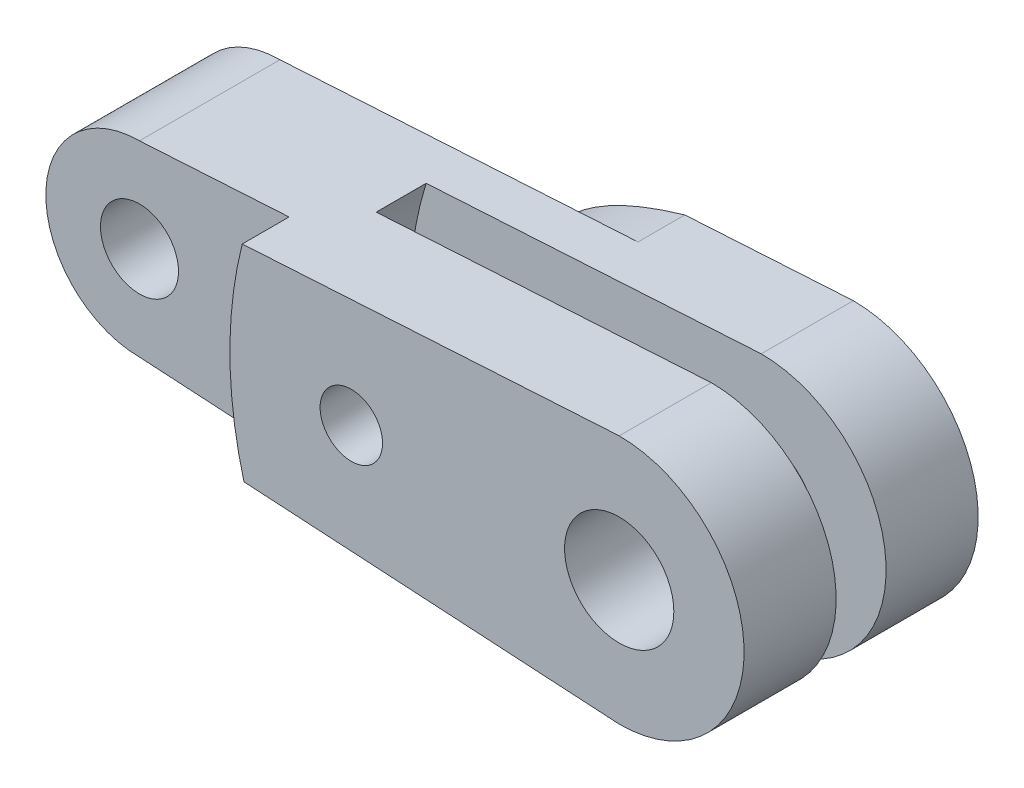
ISO-10303-21;
HEADER;
FILE_DESCRIPTION(('STEP AP214'),'2;1');
FILE_NAME('part.step','',(''),(''),'','','');
FILE_SCHEMA(('AUTOMOTIVE_DESIGN { 1 0 10303 214 1 1 1 1 }'));
ENDSEC;
DATA;
#1=APPLICATION_CONTEXT('core data for automotive mechanical design processes');
#2=APPLICATION_PROTOCOL_DEFINITION('international standard','automotive_design',2000,#1);
#3=PRODUCT_CONTEXT('',#1,'mechanical');
#4=PRODUCT('Part','Part','',(#3));
#5=PRODUCT_RELATED_PRODUCT_CATEGORY('part','',(#4));
#6=PRODUCT_DEFINITION_FORMATION('','',#4);
#7=PRODUCT_DEFINITION_CONTEXT('part definition',#1,'design');
#8=PRODUCT_DEFINITION('design','',#6,#7);
#9=PRODUCT_DEFINITION_SHAPE('','',#8);
#10=(LENGTH_UNIT() NAMED_UNIT(*) SI_UNIT(.MILLI.,.METRE.));
#11=(NAMED_UNIT(*) PLANE_ANGLE_UNIT() SI_UNIT($,.RADIAN.));
#12=(NAMED_UNIT(*) SI_UNIT($,.STERADIAN.) SOLID_ANGLE_UNIT());
#13=UNCERTAINTY_MEASURE_WITH_UNIT(LENGTH_MEASURE(1.E-05),#10,'distance_accuracy_value','');
#14=(GEOMETRIC_REPRESENTATION_CONTEXT(3) GLOBAL_UNCERTAINTY_ASSIGNED_CONTEXT((#13)) GLOBAL_UNIT_ASSIGNED_CONTEXT((#10,
#11,#12)) REPRESENTATION_CONTEXT('',''));
#15=CARTESIAN_POINT('',(0.,0.,0.));
#16=DIRECTION('',(0.,0.,1.));
#17=DIRECTION('',(1.,0.,0.));
#18=AXIS2_PLACEMENT_3D('',#15,#16,#17);
#19=CARTESIAN_POINT('',(-33.737889323296,-4.87539967165135E-12,15.));
#20=DIRECTION('',(0.,0.,-1.));
#21=DIRECTION('',(-1.,0.,0.));
#22=AXIS2_PLACEMENT_3D('',#19,#20,#21);
#23=CYLINDRICAL_SURFACE('',#22,5.99999999999999);
#24=CARTESIAN_POINT('',(-33.737889323296,-4.87539967165135E-12,3.));
#25=DIRECTION('',(0.,0.,-1.));
#26=DIRECTION('',(-1.,0.,0.));
#27=AXIS2_PLACEMENT_3D('',#24,#25,#26);
#28=CIRCLE('',#27,5.99999999999999);
#29=CARTESIAN_POINT('',(-33.737889323296,-6.00000000000487,3.));
#30=VERTEX_POINT('',#29);
#31=CARTESIAN_POINT('',(-33.737889323296,5.99999999999512,3.));
#32=VERTEX_POINT('',#31);
#33=EDGE_CURVE('E138',#30,#32,#28,.T.);
#34=ORIENTED_EDGE('',*,*,#33,.F.);
#35=DIRECTION('',(0.,0.,-1.));
#36=VECTOR('',#35,1.);
#37=CARTESIAN_POINT('',(-33.737889323296,-6.00000000000487,15.));
#38=LINE('',#37,#36);
#39=CARTESIAN_POINT('',(-33.737889323296,-6.00000000000487,12.));
#40=VERTEX_POINT('',#39);
#41=EDGE_CURVE('E169',#40,#30,#38,.T.);
#42=ORIENTED_EDGE('',*,*,#41,.F.);
#43=CARTESIAN_POINT('',(-33.737889323296,-4.87539967165135E-12,12.));
#44=DIRECTION('',(0.,0.,1.));
#45=DIRECTION('',(1.,0.,0.));
#46=AXIS2_PLACEMENT_3D('',#43,#44,#45);
#47=CIRCLE('',#46,5.99999999999999);
#48=CARTESIAN_POINT('',(-33.737889323296,5.99999999999512,12.));
#49=VERTEX_POINT('',#48);
#50=EDGE_CURVE('E128',#49,#40,#47,.T.);
#51=ORIENTED_EDGE('',*,*,#50,.F.);
#52=DIRECTION('',(0.,0.,-1.));
#53=VECTOR('',#52,1.);
#54=CARTESIAN_POINT('',(-33.737889323296,5.99999999999512,15.));
#55=LINE('',#54,#53);
#56=EDGE_CURVE('E158',#49,#32,#55,.T.);
#57=ORIENTED_EDGE('',*,*,#56,.T.);
#58=EDGE_LOOP('',(#34,#42,#51,#57));
#59=FACE_BOUND('',#58,.T.);
#60=ADVANCED_FACE('F32',(#59),#23,.T.);
#61=CARTESIAN_POINT('',(-33.737889323296,-6.00000000000487,15.));
#62=DIRECTION('',(0.0591766436408869,0.998247526842616,0.));
#63=DIRECTION('',(-0.998247526842616,0.0591766436408869,0.));
#64=AXIS2_PLACEMENT_3D('',#61,#62,#63);
#65=PLANE('',#64);
#66=DIRECTION('',(-0.998247526842616,0.0591766436408869,0.));
#67=VECTOR('',#66,1.);
#68=CARTESIAN_POINT('',(-33.737889323296,-6.00000000000487,3.));
#69=LINE('',#68,#67);
#70=CARTESIAN_POINT('',(-17.3162309471303,-6.97348463140332,3.));
#71=VERTEX_POINT('',#70);
#72=EDGE_CURVE('E137',#71,#30,#69,.T.);
#73=ORIENTED_EDGE('',*,*,#72,.F.);
#74=DIRECTION('',(0.,0.,-1.));
#75=VECTOR('',#74,1.);
#76=CARTESIAN_POINT('',(-17.3162309471256,-6.97348463140956,3.));
#77=LINE('',#76,#75);
#78=CARTESIAN_POINT('',(-17.3162309471302,-6.97348463140332,0.));
#79=VERTEX_POINT('',#78);
#80=EDGE_CURVE('E122',#71,#79,#77,.T.);
#81=ORIENTED_EDGE('',*,*,#80,.T.);
#82=DIRECTION('',(0.998247526842616,-0.0591766436408869,0.));
#83=VECTOR('',#82,1.);
#84=CARTESIAN_POINT('',(-33.737889323296,-6.00000000000487,0.));
#85=LINE('',#84,#83);
#86=CARTESIAN_POINT('',(0.,-8.,0.));
#87=VERTEX_POINT('',#86);
#88=EDGE_CURVE('E134',#79,#87,#85,.T.);
#89=ORIENTED_EDGE('',*,*,#88,.T.);
#90=DIRECTION('',(0.,0.,-1.));
#91=VECTOR('',#90,1.);
#92=CARTESIAN_POINT('',(0.,-8.,15.));
#93=LINE('',#92,#91);
#94=CARTESIAN_POINT('',(0.,-8.,5.90000000000001));
#95=VERTEX_POINT('',#94);
#96=EDGE_CURVE('E165',#95,#87,#93,.T.);
#97=ORIENTED_EDGE('',*,*,#96,.F.);
#98=DIRECTION('',(0.998247526842616,-0.0591766436408869,0.));
#99=VECTOR('',#98,1.);
#100=CARTESIAN_POINT('',(-33.737889323296,-6.00000000000487,5.90000000000001));
#101=LINE('',#100,#99);
#102=CARTESIAN_POINT('',(-21.4707889258319,-6.7272002276115,5.90000000000001));
#103=VERTEX_POINT('',#102);
#104=EDGE_CURVE('E306',#103,#95,#101,.T.);
#105=ORIENTED_EDGE('',*,*,#104,.F.);
#106=DIRECTION('',(0.,0.,1.));
#107=VECTOR('',#106,1.);
#108=CARTESIAN_POINT('',(-21.4707889258319,-6.7272002276115,5.90000000000001));
#109=LINE('',#108,#107);
#110=CARTESIAN_POINT('',(-21.4707889258319,-6.7272002276115,9.1));
#111=VERTEX_POINT('',#110);
#112=EDGE_CURVE('E175',#103,#111,#109,.T.);
#113=ORIENTED_EDGE('',*,*,#112,.T.);
#114=DIRECTION('',(0.998247526842616,-0.0591766436408869,0.));
#115=VECTOR('',#114,1.);
#116=CARTESIAN_POINT('',(-33.737889323296,-6.00000000000487,9.1));
#117=LINE('',#116,#115);
#118=CARTESIAN_POINT('',(0.,-8.,9.1));
#119=VERTEX_POINT('',#118);
#120=EDGE_CURVE('E180',#111,#119,#117,.T.);
#121=ORIENTED_EDGE('',*,*,#120,.T.);
#122=CARTESIAN_POINT('',(0.,-8.,15.));
#123=VERTEX_POINT('',#122);
#124=EDGE_CURVE('E166',#123,#119,#93,.T.);
#125=ORIENTED_EDGE('',*,*,#124,.F.);
#126=DIRECTION('',(0.998247526842616,-0.0591766436408869,0.));
#127=VECTOR('',#126,1.);
#128=CARTESIAN_POINT('',(-33.737889323296,-6.00000000000487,15.));
#129=LINE('',#128,#127);
#130=CARTESIAN_POINT('',(-24.0431356899653,-6.57471014505315,15.));
#131=VERTEX_POINT('',#130);
#132=EDGE_CURVE('E157',#131,#123,#129,.T.);
#133=ORIENTED_EDGE('',*,*,#132,.F.);
#134=DIRECTION('',(0.,0.,1.));
#135=VECTOR('',#134,1.);
#136=CARTESIAN_POINT('',(-24.0431356899653,-6.57471014505315,12.));
#137=LINE('',#136,#135);
#138=CARTESIAN_POINT('',(-24.0431356899653,-6.57471014505315,12.));
#139=VERTEX_POINT('',#138);
#140=EDGE_CURVE('E274',#131,#139,#137,.F.);
#141=ORIENTED_EDGE('',*,*,#140,.T.);
#142=DIRECTION('',(0.998247526842616,-0.0591766436408869,0.));
#143=VECTOR('',#142,1.);
#144=CARTESIAN_POINT('',(-33.737889323296,-6.00000000000487,12.));
#145=LINE('',#144,#143);
#146=EDGE_CURVE('E272',#40,#139,#145,.T.);
#147=ORIENTED_EDGE('',*,*,#146,.F.);
#148=ORIENTED_EDGE('',*,*,#41,.T.);
#149=EDGE_LOOP('',(#73,#81,#89,#97,#105,#113,#121,#125,#133,#141,#147,#148));
#150=FACE_BOUND('',#149,.T.);
#151=ADVANCED_FACE('F132',(#150),#65,.F.);
#152=CARTESIAN_POINT('',(0.,0.,15.));
#153=DIRECTION('',(0.,0.,-1.));
#154=DIRECTION('',(-1.,0.,0.));
#155=AXIS2_PLACEMENT_3D('',#152,#153,#154);
#156=CYLINDRICAL_SURFACE('',#155,8.);
#157=CARTESIAN_POINT('',(0.,0.,5.90000000000001));
#158=DIRECTION('',(0.,0.,1.));
#159=DIRECTION('',(1.,0.,0.));
#160=AXIS2_PLACEMENT_3D('',#157,#158,#159);
#161=CIRCLE('',#160,8.);
#162=CARTESIAN_POINT('',(0.,8.,5.90000000000001));
#163=VERTEX_POINT('',#162);
#164=EDGE_CURVE('E304',#95,#163,#161,.T.);
#165=ORIENTED_EDGE('',*,*,#164,.F.);
#166=ORIENTED_EDGE('',*,*,#96,.T.);
#167=CARTESIAN_POINT('',(0.,0.,0.));
#168=DIRECTION('',(0.,0.,1.));
#169=DIRECTION('',(1.,0.,0.));
#170=AXIS2_PLACEMENT_3D('',#167,#168,#169);
#171=CIRCLE('',#170,8.);
#172=CARTESIAN_POINT('',(0.,8.,0.));
#173=VERTEX_POINT('',#172);
#174=EDGE_CURVE('E144',#87,#173,#171,.T.);
#175=ORIENTED_EDGE('',*,*,#174,.T.);
#176=DIRECTION('',(0.,0.,-1.));
#177=VECTOR('',#176,1.);
#178=CARTESIAN_POINT('',(0.,8.,15.));
#179=LINE('',#178,#177);
#180=EDGE_CURVE('E161',#163,#173,#179,.T.);
#181=ORIENTED_EDGE('',*,*,#180,.F.);
#182=EDGE_LOOP('',(#165,#166,#175,#181));
#183=FACE_BOUND('',#182,.T.);
#184=ADVANCED_FACE('F251',(#183),#156,.T.);
#185=CARTESIAN_POINT('',(-33.737889323296,5.99999999999512,15.));
#186=DIRECTION('',(0.0591766436411744,-0.998247526842599,0.));
#187=DIRECTION('',(0.998247526842599,0.0591766436411745,0.));
#188=AXIS2_PLACEMENT_3D('',#185,#186,#187);
#189=PLANE('',#188);
#190=DIRECTION('',(-0.998247526842599,-0.0591766436411744,0.));
#191=VECTOR('',#190,1.);
#192=CARTESIAN_POINT('',(-33.737889323296,5.99999999999512,0.));
#193=LINE('',#192,#191);
#194=CARTESIAN_POINT('',(-10.7942181735952,7.36011301298756,0.));
#195=VERTEX_POINT('',#194);
#196=EDGE_CURVE('E147',#173,#195,#193,.T.);
#197=ORIENTED_EDGE('',*,*,#196,.T.);
#198=DIRECTION('',(0.,0.,-1.));
#199=VECTOR('',#198,1.);
#200=CARTESIAN_POINT('',(-10.7942181736966,7.36011301298155,3.));
#201=LINE('',#200,#199);
#202=CARTESIAN_POINT('',(-10.7942181735965,7.36011301301046,3.));
#203=VERTEX_POINT('',#202);
#204=EDGE_CURVE('E48',#195,#203,#201,.F.);
#205=ORIENTED_EDGE('',*,*,#204,.T.);
#206=DIRECTION('',(0.998247526842599,0.0591766436411745,0.));
#207=VECTOR('',#206,1.);
#208=CARTESIAN_POINT('',(-33.737889323296,5.99999999999512,3.));
#209=LINE('',#208,#207);
#210=EDGE_CURVE('E11',#32,#203,#209,.T.);
#211=ORIENTED_EDGE('',*,*,#210,.F.);
#212=ORIENTED_EDGE('',*,*,#56,.F.);
#213=DIRECTION('',(-0.998247526842599,-0.0591766436411745,0.));
#214=VECTOR('',#213,1.);
#215=CARTESIAN_POINT('',(-33.737889323296,5.99999999999512,12.));
#216=LINE('',#215,#214);
#217=CARTESIAN_POINT('',(-24.152628444265,6.56821935641086,12.));
#218=VERTEX_POINT('',#217);
#219=EDGE_CURVE('E56',#218,#49,#216,.T.);
#220=ORIENTED_EDGE('',*,*,#219,.F.);
#221=DIRECTION('',(0.,0.,1.));
#222=VECTOR('',#221,1.);
#223=CARTESIAN_POINT('',(-24.152628444265,6.56821935641086,12.));
#224=LINE('',#223,#222);
#225=CARTESIAN_POINT('',(-24.152628444265,6.56821935641086,15.));
#226=VERTEX_POINT('',#225);
#227=EDGE_CURVE('E276',#218,#226,#224,.T.);
#228=ORIENTED_EDGE('',*,*,#227,.T.);
#229=DIRECTION('',(-0.998247526842599,-0.0591766436411744,0.));
#230=VECTOR('',#229,1.);
#231=CARTESIAN_POINT('',(-33.737889323296,5.99999999999512,15.));
#232=LINE('',#231,#230);
#233=CARTESIAN_POINT('',(0.,8.,15.));
#234=VERTEX_POINT('',#233);
#235=EDGE_CURVE('E153',#234,#226,#232,.T.);
#236=ORIENTED_EDGE('',*,*,#235,.F.);
#237=CARTESIAN_POINT('',(0.,8.,9.1));
#238=VERTEX_POINT('',#237);
#239=EDGE_CURVE('E162',#234,#238,#179,.T.);
#240=ORIENTED_EDGE('',*,*,#239,.T.);
#241=DIRECTION('',(-0.998247526842599,-0.0591766436411745,0.));
#242=VECTOR('',#241,1.);
#243=CARTESIAN_POINT('',(-33.737889323296,5.99999999999512,9.1));
#244=LINE('',#243,#242);
#245=CARTESIAN_POINT('',(-21.4707889154994,6.72720022822083,9.1));
#246=VERTEX_POINT('',#245);
#247=EDGE_CURVE('E174',#238,#246,#244,.T.);
#248=ORIENTED_EDGE('',*,*,#247,.T.);
#249=DIRECTION('',(0.,0.,1.));
#250=VECTOR('',#249,1.);
#251=CARTESIAN_POINT('',(-21.4707889258338,6.72720022760519,5.90000000000001));
#252=LINE('',#251,#250);
#253=CARTESIAN_POINT('',(-21.4707889258338,6.72720022760519,5.90000000000001));
#254=VERTEX_POINT('',#253);
#255=EDGE_CURVE('E289',#254,#246,#252,.T.);
#256=ORIENTED_EDGE('',*,*,#255,.F.);
#257=DIRECTION('',(-0.998247526842599,-0.0591766436411745,0.));
#258=VECTOR('',#257,1.);
#259=CARTESIAN_POINT('',(-33.737889323296,5.99999999999512,5.90000000000001));
#260=LINE('',#259,#258);
#261=EDGE_CURVE('E179',#163,#254,#260,.T.);
#262=ORIENTED_EDGE('',*,*,#261,.F.);
#263=ORIENTED_EDGE('',*,*,#180,.T.);
#264=EDGE_LOOP('',(#197,#205,#211,#212,#220,#228,#236,#240,#248,#256,#262,#263));
#265=FACE_BOUND('',#264,.T.);
#266=ADVANCED_FACE('F248',(#265),#189,.F.);
#267=CARTESIAN_POINT('',(0.,0.,15.));
#268=DIRECTION('',(0.,0.,-1.));
#269=DIRECTION('',(-1.,0.,0.));
#270=AXIS2_PLACEMENT_3D('',#267,#268,#269);
#271=CYLINDRICAL_SURFACE('',#270,3.5);
#272=CARTESIAN_POINT('',(0.,0.,0.));
#273=DIRECTION('',(0.,0.,1.));
#274=DIRECTION('',(1.,0.,0.));
#275=AXIS2_PLACEMENT_3D('',#272,#273,#274);
#276=CIRCLE('',#275,3.5);
#277=CARTESIAN_POINT('',(3.5,0.,0.));
#278=VERTEX_POINT('',#277);
#279=EDGE_CURVE('E150',#278,#278,#276,.T.);
#280=ORIENTED_EDGE('',*,*,#279,.F.);
#281=EDGE_LOOP('',(#280));
#282=FACE_BOUND('',#281,.T.);
#283=CARTESIAN_POINT('',(0.,0.,5.90000000000001));
#284=DIRECTION('',(0.,0.,1.));
#285=DIRECTION('',(1.,0.,0.));
#286=AXIS2_PLACEMENT_3D('',#283,#284,#285);
#287=CIRCLE('',#286,3.5);
#288=CARTESIAN_POINT('',(3.5,0.,5.90000000000001));
#289=VERTEX_POINT('',#288);
#290=EDGE_CURVE('E176',#289,#289,#287,.T.);
#291=ORIENTED_EDGE('',*,*,#290,.T.);
#292=EDGE_LOOP('',(#291));
#293=FACE_BOUND('',#292,.T.);
#294=ADVANCED_FACE('F240',(#282,#293),#271,.F.);
#295=CARTESIAN_POINT('',(-33.737889323296,-4.87539967165135E-12,15.));
#296=DIRECTION('',(0.,0.,1.));
#297=DIRECTION('',(1.,0.,0.));
#298=AXIS2_PLACEMENT_3D('',#295,#296,#297);
#299=PLANE('',#298);
#300=CARTESIAN_POINT('',(-17.1655859216768,0.,15.));
#301=DIRECTION('',(0.,0.,1.));
#302=DIRECTION('',(1.,0.,0.));
#303=AXIS2_PLACEMENT_3D('',#300,#301,#302);
#304=CIRCLE('',#303,2.);
#305=CARTESIAN_POINT('',(-15.1655859216768,0.,15.));
#306=VERTEX_POINT('',#305);
#307=EDGE_CURVE('E461',#306,#306,#304,.T.);
#308=ORIENTED_EDGE('',*,*,#307,.F.);
#309=EDGE_LOOP('',(#308));
#310=FACE_BOUND('',#309,.T.);
#311=CARTESIAN_POINT('',(0.971214148567774,0.20560335527881,15.));
#312=DIRECTION('',(0.,0.,-1.));
#313=DIRECTION('',(1.,0.,0.));
#314=AXIS2_PLACEMENT_3D('',#311,#312,#313);
#315=CIRCLE('',#314,25.9169895822663);
#316=EDGE_CURVE('E318',#131,#226,#315,.T.);
#317=ORIENTED_EDGE('',*,*,#316,.F.);
#318=ORIENTED_EDGE('',*,*,#132,.T.);
#319=CARTESIAN_POINT('',(0.,0.,15.));
#320=DIRECTION('',(0.,0.,1.));
#321=DIRECTION('',(1.,0.,0.));
#322=AXIS2_PLACEMENT_3D('',#319,#320,#321);
#323=CIRCLE('',#322,8.);
#324=EDGE_CURVE('E310',#123,#234,#323,.T.);
#325=ORIENTED_EDGE('',*,*,#324,.T.);
#326=ORIENTED_EDGE('',*,*,#235,.T.);
#327=EDGE_LOOP('',(#317,#318,#325,#326));
#328=FACE_BOUND('',#327,.T.);
#329=CARTESIAN_POINT('',(0.,0.,15.));
#330=DIRECTION('',(0.,0.,1.));
#331=DIRECTION('',(1.,0.,0.));
#332=AXIS2_PLACEMENT_3D('',#329,#330,#331);
#333=CIRCLE('',#332,3.5);
#334=CARTESIAN_POINT('',(3.5,0.,15.));
#335=VERTEX_POINT('',#334);
#336=EDGE_CURVE('E145',#335,#335,#333,.T.);
#337=ORIENTED_EDGE('',*,*,#336,.F.);
#338=EDGE_LOOP('',(#337));
#339=FACE_BOUND('',#338,.T.);
#340=ADVANCED_FACE('F241',(#310,#328,#339),#299,.T.);
#341=CARTESIAN_POINT('',(-33.737889323296,-4.87539967165135E-12,0.));
#342=DIRECTION('',(0.,0.,1.));
#343=DIRECTION('',(1.,0.,0.));
#344=AXIS2_PLACEMENT_3D('',#341,#342,#343);
#345=PLANE('',#344);
#346=CARTESIAN_POINT('',(-17.1655859216768,0.,0.));
#347=DIRECTION('',(0.,0.,1.));
#348=DIRECTION('',(1.,0.,0.));
#349=AXIS2_PLACEMENT_3D('',#346,#347,#348);
#350=CIRCLE('',#349,2.);
#351=CARTESIAN_POINT('',(-15.1655859216768,0.,0.));
#352=VERTEX_POINT('',#351);
#353=EDGE_CURVE('E460',#352,#352,#350,.T.);
#354=ORIENTED_EDGE('',*,*,#353,.T.);
#355=EDGE_LOOP('',(#354));
#356=FACE_BOUND('',#355,.T.);
#357=ORIENTED_EDGE('',*,*,#88,.F.);
#358=CARTESIAN_POINT('',(-7.50186050798429,8.16891895740328,0.));
#359=CARTESIAN_POINT('',(-26.5456383588368,4.19848570571451,0.));
#360=CARTESIAN_POINT('',(-16.6085177082451,-7.87158316856867,0.));
#361=B_SPLINE_CURVE_WITH_KNOTS('',2,(#358,#359,#360),.UNSPECIFIED.,.F.,.F.,(3,3),(0.,1.),.UNSPECIFIED.);
#362=EDGE_CURVE('E40',#79,#195,#361,.F.);
#363=ORIENTED_EDGE('',*,*,#362,.T.);
#364=ORIENTED_EDGE('',*,*,#196,.F.);
#365=ORIENTED_EDGE('',*,*,#174,.F.);
#366=EDGE_LOOP('',(#357,#363,#364,#365));
#367=FACE_BOUND('',#366,.T.);
#368=ORIENTED_EDGE('',*,*,#279,.T.);
#369=EDGE_LOOP('',(#368));
#370=FACE_BOUND('',#369,.T.);
#371=ADVANCED_FACE('F141',(#356,#367,#370),#345,.F.);
#372=ORIENTED_EDGE('',*,*,#124,.T.);
#373=CARTESIAN_POINT('',(0.,0.,9.1));
#374=DIRECTION('',(0.,0.,1.));
#375=DIRECTION('',(1.,0.,0.));
#376=AXIS2_PLACEMENT_3D('',#373,#374,#375);
#377=CIRCLE('',#376,8.);
#378=EDGE_CURVE('E298',#119,#238,#377,.T.);
#379=ORIENTED_EDGE('',*,*,#378,.T.);
#380=ORIENTED_EDGE('',*,*,#239,.F.);
#381=ORIENTED_EDGE('',*,*,#324,.F.);
#382=EDGE_LOOP('',(#372,#379,#380,#381));
#383=FACE_BOUND('',#382,.T.);
#384=ADVANCED_FACE('F238',(#383),#156,.T.);
#385=CARTESIAN_POINT('',(0.,0.,9.1));
#386=DIRECTION('',(0.,0.,1.));
#387=DIRECTION('',(1.,0.,0.));
#388=AXIS2_PLACEMENT_3D('',#385,#386,#387);
#389=CIRCLE('',#388,3.5);
#390=CARTESIAN_POINT('',(3.5,0.,9.1));
#391=VERTEX_POINT('',#390);
#392=EDGE_CURVE('E171',#391,#391,#389,.T.);
#393=ORIENTED_EDGE('',*,*,#392,.F.);
#394=EDGE_LOOP('',(#393));
#395=FACE_BOUND('',#394,.T.);
#396=ORIENTED_EDGE('',*,*,#336,.T.);
#397=EDGE_LOOP('',(#396));
#398=FACE_BOUND('',#397,.T.);
#399=ADVANCED_FACE('F228',(#395,#398),#271,.F.);
#400=CARTESIAN_POINT('',(-2.67147415300428E-13,0.,5.90000000000001));
#401=DIRECTION('',(0.,0.,1.));
#402=DIRECTION('',(1.,0.,0.));
#403=AXIS2_PLACEMENT_3D('',#400,#401,#402);
#404=PLANE('',#403);
#405=CARTESIAN_POINT('',(-17.1655859216768,0.,5.90000000000001));
#406=DIRECTION('',(0.,0.,1.));
#407=DIRECTION('',(1.,0.,0.));
#408=AXIS2_PLACEMENT_3D('',#405,#406,#407);
#409=CIRCLE('',#408,2.);
#410=CARTESIAN_POINT('',(-15.1655859216768,0.,5.90000000000001));
#411=VERTEX_POINT('',#410);
#412=EDGE_CURVE('E194',#411,#411,#409,.T.);
#413=ORIENTED_EDGE('',*,*,#412,.F.);
#414=EDGE_LOOP('',(#413));
#415=FACE_BOUND('',#414,.T.);
#416=ORIENTED_EDGE('',*,*,#290,.F.);
#417=EDGE_LOOP('',(#416));
#418=FACE_BOUND('',#417,.T.);
#419=ORIENTED_EDGE('',*,*,#104,.T.);
#420=ORIENTED_EDGE('',*,*,#164,.T.);
#421=ORIENTED_EDGE('',*,*,#261,.T.);
#422=CARTESIAN_POINT('',(-2.67147415300428E-13,0.,5.90000000000001));
#423=DIRECTION('',(0.,0.,1.));
#424=DIRECTION('',(1.,0.,0.));
#425=AXIS2_PLACEMENT_3D('',#422,#423,#424);
#426=CIRCLE('',#425,22.4999999999997);
#427=EDGE_CURVE('E286',#254,#103,#426,.T.);
#428=ORIENTED_EDGE('',*,*,#427,.T.);
#429=EDGE_LOOP('',(#419,#420,#421,#428));
#430=FACE_BOUND('',#429,.T.);
#431=ADVANCED_FACE('F224',(#415,#418,#430),#404,.T.);
#432=CARTESIAN_POINT('',(-2.67147415300428E-13,0.,9.1));
#433=DIRECTION('',(0.,0.,1.));
#434=DIRECTION('',(1.,0.,0.));
#435=AXIS2_PLACEMENT_3D('',#432,#433,#434);
#436=PLANE('',#435);
#437=CARTESIAN_POINT('',(-17.1655859216768,0.,9.1));
#438=DIRECTION('',(0.,0.,1.));
#439=DIRECTION('',(1.,0.,0.));
#440=AXIS2_PLACEMENT_3D('',#437,#438,#439);
#441=CIRCLE('',#440,2.);
#442=CARTESIAN_POINT('',(-15.1655859216768,0.,9.1));
#443=VERTEX_POINT('',#442);
#444=EDGE_CURVE('E35',#443,#443,#441,.T.);
#445=ORIENTED_EDGE('',*,*,#444,.T.);
#446=EDGE_LOOP('',(#445));
#447=FACE_BOUND('',#446,.T.);
#448=ORIENTED_EDGE('',*,*,#392,.T.);
#449=EDGE_LOOP('',(#448));
#450=FACE_BOUND('',#449,.T.);
#451=CARTESIAN_POINT('',(-2.67147415300428E-13,0.,9.1));
#452=DIRECTION('',(0.,0.,1.));
#453=DIRECTION('',(1.,0.,0.));
#454=AXIS2_PLACEMENT_3D('',#451,#452,#453);
#455=CIRCLE('',#454,22.4999999999997);
#456=EDGE_CURVE('E285',#246,#111,#455,.T.);
#457=ORIENTED_EDGE('',*,*,#456,.F.);
#458=ORIENTED_EDGE('',*,*,#247,.F.);
#459=ORIENTED_EDGE('',*,*,#378,.F.);
#460=ORIENTED_EDGE('',*,*,#120,.F.);
#461=EDGE_LOOP('',(#457,#458,#459,#460));
#462=FACE_BOUND('',#461,.T.);
#463=ADVANCED_FACE('F227',(#447,#450,#462),#436,.F.);
#464=CARTESIAN_POINT('',(-2.67147415300428E-13,0.,5.90000000000001));
#465=DIRECTION('',(0.,0.,1.));
#466=DIRECTION('',(1.,0.,0.));
#467=AXIS2_PLACEMENT_3D('',#464,#465,#466);
#468=CYLINDRICAL_SURFACE('',#467,22.4999999999997);
#469=ORIENTED_EDGE('',*,*,#456,.T.);
#470=ORIENTED_EDGE('',*,*,#112,.F.);
#471=ORIENTED_EDGE('',*,*,#427,.F.);
#472=ORIENTED_EDGE('',*,*,#255,.T.);
#473=EDGE_LOOP('',(#469,#470,#471,#472));
#474=FACE_BOUND('',#473,.T.);
#475=ADVANCED_FACE('F222',(#474),#468,.F.);
#476=CARTESIAN_POINT('',(0.971214148567774,0.20560335527881,12.));
#477=DIRECTION('',(0.,0.,1.));
#478=DIRECTION('',(1.,0.,0.));
#479=AXIS2_PLACEMENT_3D('',#476,#477,#478);
#480=CYLINDRICAL_SURFACE('',#479,25.9169895822663);
#481=ORIENTED_EDGE('',*,*,#316,.T.);
#482=ORIENTED_EDGE('',*,*,#227,.F.);
#483=CARTESIAN_POINT('',(0.971214148567774,0.20560335527881,12.));
#484=DIRECTION('',(0.,0.,-1.));
#485=DIRECTION('',(1.,0.,0.));
#486=AXIS2_PLACEMENT_3D('',#483,#484,#485);
#487=CIRCLE('',#486,25.9169895822663);
#488=EDGE_CURVE('E280',#139,#218,#487,.T.);
#489=ORIENTED_EDGE('',*,*,#488,.F.);
#490=ORIENTED_EDGE('',*,*,#140,.F.);
#491=EDGE_LOOP('',(#481,#482,#489,#490));
#492=FACE_BOUND('',#491,.T.);
#493=ADVANCED_FACE('F218',(#492),#480,.T.);
#494=CARTESIAN_POINT('',(0.971214148567774,0.20560335527881,12.));
#495=DIRECTION('',(0.,0.,1.));
#496=DIRECTION('',(1.,0.,0.));
#497=AXIS2_PLACEMENT_3D('',#494,#495,#496);
#498=PLANE('',#497);
#499=CARTESIAN_POINT('',(-33.737889323296,-4.87539967165135E-12,12.));
#500=DIRECTION('',(0.,0.,1.));
#501=DIRECTION('',(1.,0.,0.));
#502=AXIS2_PLACEMENT_3D('',#499,#500,#501);
#503=CIRCLE('',#502,2.5);
#504=CARTESIAN_POINT('',(-31.237889323296,-4.87539967165135E-12,12.));
#505=VERTEX_POINT('',#504);
#506=EDGE_CURVE('E189',#505,#505,#503,.T.);
#507=ORIENTED_EDGE('',*,*,#506,.F.);
#508=EDGE_LOOP('',(#507));
#509=FACE_BOUND('',#508,.T.);
#510=ORIENTED_EDGE('',*,*,#146,.T.);
#511=ORIENTED_EDGE('',*,*,#488,.T.);
#512=ORIENTED_EDGE('',*,*,#219,.T.);
#513=ORIENTED_EDGE('',*,*,#50,.T.);
#514=EDGE_LOOP('',(#510,#511,#512,#513));
#515=FACE_BOUND('',#514,.T.);
#516=ADVANCED_FACE('F215',(#509,#515),#498,.T.);
#517=CARTESIAN_POINT('',(-19.3004137334757,2.17357680006591,3.));
#518=DIRECTION('',(0.,0.,-1.));
#519=DIRECTION('',(-1.,0.,0.));
#520=AXIS2_PLACEMENT_3D('',#517,#518,#519);
#521=PLANE('',#520);
#522=CARTESIAN_POINT('',(-33.737889323296,-4.87539967165135E-12,3.));
#523=DIRECTION('',(0.,0.,-1.));
#524=DIRECTION('',(-1.,0.,0.));
#525=AXIS2_PLACEMENT_3D('',#522,#523,#524);
#526=CIRCLE('',#525,2.5);
#527=CARTESIAN_POINT('',(-36.237889323296,-4.87539967165135E-12,3.));
#528=VERTEX_POINT('',#527);
#529=EDGE_CURVE('E186',#528,#528,#526,.T.);
#530=ORIENTED_EDGE('',*,*,#529,.F.);
#531=EDGE_LOOP('',(#530));
#532=FACE_BOUND('',#531,.T.);
#533=ORIENTED_EDGE('',*,*,#72,.T.);
#534=ORIENTED_EDGE('',*,*,#33,.T.);
#535=ORIENTED_EDGE('',*,*,#210,.T.);
#536=CARTESIAN_POINT('',(-7.50186050798429,8.16891895740328,3.));
#537=CARTESIAN_POINT('',(-26.5456383588368,4.19848570571451,3.));
#538=CARTESIAN_POINT('',(-16.6085177082451,-7.87158316856867,3.));
#539=B_SPLINE_CURVE_WITH_KNOTS('',2,(#536,#537,#538),.UNSPECIFIED.,.F.,.F.,(3,3),(0.,1.),.UNSPECIFIED.);
#540=EDGE_CURVE('E188',#203,#71,#539,.T.);
#541=ORIENTED_EDGE('',*,*,#540,.T.);
#542=EDGE_LOOP('',(#533,#534,#535,#541));
#543=FACE_BOUND('',#542,.T.);
#544=ADVANCED_FACE('F213',(#532,#543),#521,.T.);
#545=DIRECTION('',(0.,0.,-1.));
#546=VECTOR('',#545,1.);
#547=SURFACE_OF_LINEAR_EXTRUSION('',#539,#546);
#548=ORIENTED_EDGE('',*,*,#540,.F.);
#549=ORIENTED_EDGE('',*,*,#204,.F.);
#550=ORIENTED_EDGE('',*,*,#362,.F.);
#551=ORIENTED_EDGE('',*,*,#80,.F.);
#552=EDGE_LOOP('',(#548,#549,#550,#551));
#553=FACE_BOUND('',#552,.T.);
#554=ADVANCED_FACE('F121',(#553),#547,.F.);
#555=CARTESIAN_POINT('',(-33.737889323296,-4.87539967165135E-12,-3.));
#556=DIRECTION('',(0.,0.,1.));
#557=DIRECTION('',(1.,0.,0.));
#558=AXIS2_PLACEMENT_3D('',#555,#556,#557);
#559=CYLINDRICAL_SURFACE('',#558,2.5);
#560=ORIENTED_EDGE('',*,*,#529,.T.);
#561=EDGE_LOOP('',(#560));
#562=FACE_BOUND('',#561,.T.);
#563=ORIENTED_EDGE('',*,*,#506,.T.);
#564=EDGE_LOOP('',(#563));
#565=FACE_BOUND('',#564,.T.);
#566=ADVANCED_FACE('F212',(#562,#565),#559,.F.);
#567=CARTESIAN_POINT('',(-17.1655859216768,0.,0.));
#568=DIRECTION('',(0.,0.,1.));
#569=DIRECTION('',(1.,0.,0.));
#570=AXIS2_PLACEMENT_3D('',#567,#568,#569);
#571=CYLINDRICAL_SURFACE('',#570,2.);
#572=ORIENTED_EDGE('',*,*,#307,.T.);
#573=EDGE_LOOP('',(#572));
#574=FACE_BOUND('',#573,.T.);
#575=ORIENTED_EDGE('',*,*,#444,.F.);
#576=EDGE_LOOP('',(#575));
#577=FACE_BOUND('',#576,.T.);
#578=ADVANCED_FACE('F347',(#574,#577),#571,.F.);
#579=ORIENTED_EDGE('',*,*,#412,.T.);
#580=EDGE_LOOP('',(#579));
#581=FACE_BOUND('',#580,.T.);
#582=ORIENTED_EDGE('',*,*,#353,.F.);
#583=EDGE_LOOP('',(#582));
#584=FACE_BOUND('',#583,.T.);
#585=ADVANCED_FACE('F354',(#581,#584),#571,.F.);
#586=CLOSED_SHELL('',(#60,#151,#184,#266,#294,#340,#371,#384,#399,#431,#463,#475,#493,#516,#544,
#554,#566,#578,#585));
#587=MANIFOLD_SOLID_BREP('B2',#586);
#588=ADVANCED_BREP_SHAPE_REPRESENTATION('',(#18,#587),#14);
#589=SHAPE_DEFINITION_REPRESENTATION(#9,#588);
ENDSEC;
END-ISO-10303-21;
